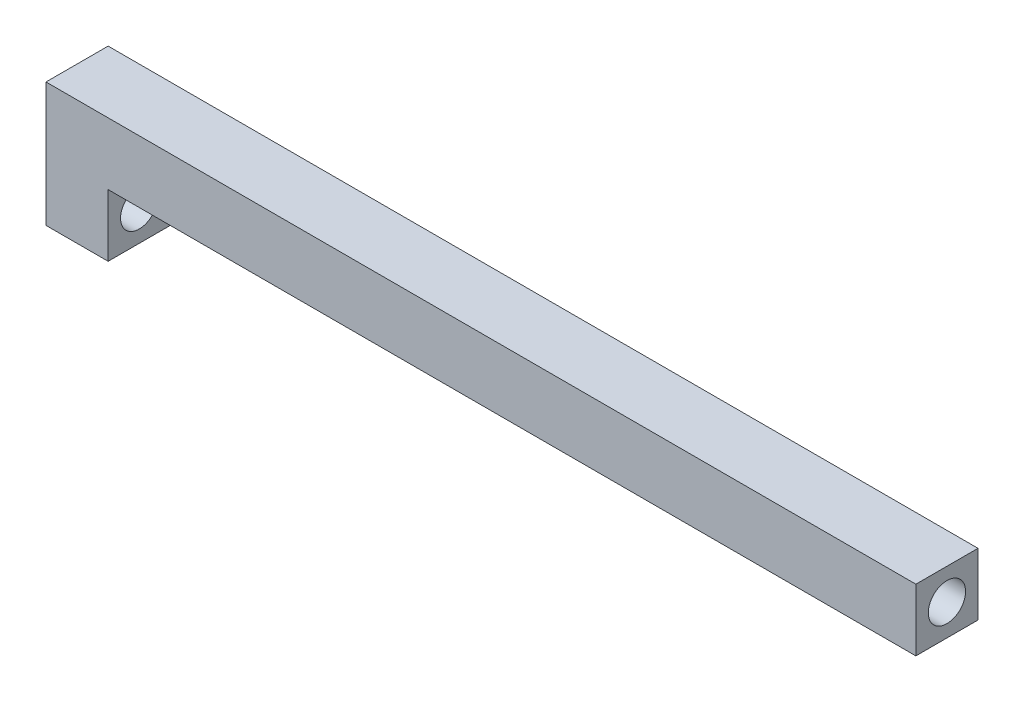
ISO-10303-21;
HEADER;
FILE_DESCRIPTION(('STEP AP214'),'2;1');
FILE_NAME('part.step','',(''),(''),'','','');
FILE_SCHEMA(('AUTOMOTIVE_DESIGN { 1 0 10303 214 1 1 1 1 }'));
ENDSEC;
DATA;
#1=APPLICATION_CONTEXT('core data for automotive mechanical design processes');
#2=APPLICATION_PROTOCOL_DEFINITION('international standard','automotive_design',2000,#1);
#3=PRODUCT_CONTEXT('',#1,'mechanical');
#4=PRODUCT('Part','Part','',(#3));
#5=PRODUCT_RELATED_PRODUCT_CATEGORY('part','',(#4));
#6=PRODUCT_DEFINITION_FORMATION('','',#4);
#7=PRODUCT_DEFINITION_CONTEXT('part definition',#1,'design');
#8=PRODUCT_DEFINITION('design','',#6,#7);
#9=PRODUCT_DEFINITION_SHAPE('','',#8);
#10=(LENGTH_UNIT() NAMED_UNIT(*) SI_UNIT(.MILLI.,.METRE.));
#11=(NAMED_UNIT(*) PLANE_ANGLE_UNIT() SI_UNIT($,.RADIAN.));
#12=(NAMED_UNIT(*) SI_UNIT($,.STERADIAN.) SOLID_ANGLE_UNIT());
#13=UNCERTAINTY_MEASURE_WITH_UNIT(LENGTH_MEASURE(1.E-05),#10,'distance_accuracy_value','');
#14=(GEOMETRIC_REPRESENTATION_CONTEXT(3) GLOBAL_UNCERTAINTY_ASSIGNED_CONTEXT((#13)) GLOBAL_UNIT_ASSIGNED_CONTEXT((#10,
#11,#12)) REPRESENTATION_CONTEXT('',''));
#15=CARTESIAN_POINT('',(0.,0.,0.));
#16=DIRECTION('',(0.,0.,1.));
#17=DIRECTION('',(1.,0.,0.));
#18=AXIS2_PLACEMENT_3D('',#15,#16,#17);
#19=CARTESIAN_POINT('',(-140.,10.,10.));
#20=DIRECTION('',(1.,0.,0.));
#21=DIRECTION('',(0.,1.,0.));
#22=AXIS2_PLACEMENT_3D('',#19,#20,#21);
#23=PLANE('',#22);
#24=CARTESIAN_POINT('',(-140.,-5.,5.));
#25=DIRECTION('',(1.,0.,0.));
#26=DIRECTION('',(0.,1.,0.));
#27=AXIS2_PLACEMENT_3D('',#24,#25,#26);
#28=CIRCLE('',#27,3.);
#29=CARTESIAN_POINT('',(-140.,-2.,5.));
#30=VERTEX_POINT('',#29);
#31=EDGE_CURVE('E134',#30,#30,#28,.T.);
#32=ORIENTED_EDGE('',*,*,#31,.T.);
#33=EDGE_LOOP('',(#32));
#34=FACE_BOUND('',#33,.T.);
#35=DIRECTION('',(0.,-1.,0.));
#36=VECTOR('',#35,1.);
#37=CARTESIAN_POINT('',(-140.,10.,0.));
#38=LINE('',#37,#36);
#39=CARTESIAN_POINT('',(-140.,10.,0.));
#40=VERTEX_POINT('',#39);
#41=CARTESIAN_POINT('',(-140.,-10.,0.));
#42=VERTEX_POINT('',#41);
#43=EDGE_CURVE('E129',#40,#42,#38,.T.);
#44=ORIENTED_EDGE('',*,*,#43,.T.);
#45=DIRECTION('',(0.,0.,-1.));
#46=VECTOR('',#45,1.);
#47=CARTESIAN_POINT('',(-140.,-10.,10.));
#48=LINE('',#47,#46);
#49=CARTESIAN_POINT('',(-140.,-10.,10.));
#50=VERTEX_POINT('',#49);
#51=EDGE_CURVE('E11',#50,#42,#48,.T.);
#52=ORIENTED_EDGE('',*,*,#51,.F.);
#53=DIRECTION('',(0.,-1.,0.));
#54=VECTOR('',#53,1.);
#55=CARTESIAN_POINT('',(-140.,10.,10.));
#56=LINE('',#55,#54);
#57=CARTESIAN_POINT('',(-140.,10.,10.));
#58=VERTEX_POINT('',#57);
#59=EDGE_CURVE('E146',#58,#50,#56,.T.);
#60=ORIENTED_EDGE('',*,*,#59,.F.);
#61=DIRECTION('',(0.,0.,-1.));
#62=VECTOR('',#61,1.);
#63=CARTESIAN_POINT('',(-140.,10.,10.));
#64=LINE('',#63,#62);
#65=EDGE_CURVE('E125',#58,#40,#64,.T.);
#66=ORIENTED_EDGE('',*,*,#65,.T.);
#67=EDGE_LOOP('',(#44,#52,#60,#66));
#68=FACE_BOUND('',#67,.T.);
#69=ADVANCED_FACE('F39',(#34,#68),#23,.F.);
#70=CARTESIAN_POINT('',(-140.,-10.,10.));
#71=DIRECTION('',(0.,1.,0.));
#72=DIRECTION('',(-1.,0.,0.));
#73=AXIS2_PLACEMENT_3D('',#70,#71,#72);
#74=PLANE('',#73);
#75=DIRECTION('',(1.,0.,0.));
#76=VECTOR('',#75,1.);
#77=CARTESIAN_POINT('',(-140.,-10.,0.));
#78=LINE('',#77,#76);
#79=CARTESIAN_POINT('',(-130.,-10.,0.));
#80=VERTEX_POINT('',#79);
#81=EDGE_CURVE('E133',#42,#80,#78,.T.);
#82=ORIENTED_EDGE('',*,*,#81,.T.);
#83=DIRECTION('',(0.,0.,-1.));
#84=VECTOR('',#83,1.);
#85=CARTESIAN_POINT('',(-130.,-10.,10.));
#86=LINE('',#85,#84);
#87=CARTESIAN_POINT('',(-130.,-10.,10.));
#88=VERTEX_POINT('',#87);
#89=EDGE_CURVE('E49',#88,#80,#86,.T.);
#90=ORIENTED_EDGE('',*,*,#89,.F.);
#91=DIRECTION('',(1.,0.,0.));
#92=VECTOR('',#91,1.);
#93=CARTESIAN_POINT('',(-140.,-10.,10.));
#94=LINE('',#93,#92);
#95=EDGE_CURVE('E94',#50,#88,#94,.T.);
#96=ORIENTED_EDGE('',*,*,#95,.F.);
#97=ORIENTED_EDGE('',*,*,#51,.T.);
#98=EDGE_LOOP('',(#82,#90,#96,#97));
#99=FACE_BOUND('',#98,.T.);
#100=ADVANCED_FACE('F176',(#99),#74,.F.);
#101=CARTESIAN_POINT('',(-130.,0.,10.));
#102=DIRECTION('',(-1.,0.,0.));
#103=DIRECTION('',(0.,0.,1.));
#104=AXIS2_PLACEMENT_3D('',#101,#102,#103);
#105=PLANE('',#104);
#106=CARTESIAN_POINT('',(-130.,-5.,5.));
#107=DIRECTION('',(-1.,0.,0.));
#108=DIRECTION('',(0.,0.,1.));
#109=AXIS2_PLACEMENT_3D('',#106,#107,#108);
#110=CIRCLE('',#109,3.);
#111=CARTESIAN_POINT('',(-130.,-5.,8.));
#112=VERTEX_POINT('',#111);
#113=EDGE_CURVE('E42',#112,#112,#110,.T.);
#114=ORIENTED_EDGE('',*,*,#113,.T.);
#115=EDGE_LOOP('',(#114));
#116=FACE_BOUND('',#115,.T.);
#117=DIRECTION('',(0.,1.,0.));
#118=VECTOR('',#117,1.);
#119=CARTESIAN_POINT('',(-130.,0.,0.));
#120=LINE('',#119,#118);
#121=CARTESIAN_POINT('',(-130.,0.,0.));
#122=VERTEX_POINT('',#121);
#123=EDGE_CURVE('E137',#80,#122,#120,.T.);
#124=ORIENTED_EDGE('',*,*,#123,.T.);
#125=DIRECTION('',(0.,0.,-1.));
#126=VECTOR('',#125,1.);
#127=CARTESIAN_POINT('',(-130.,0.,10.));
#128=LINE('',#127,#126);
#129=CARTESIAN_POINT('',(-130.,0.,10.));
#130=VERTEX_POINT('',#129);
#131=EDGE_CURVE('E118',#130,#122,#128,.T.);
#132=ORIENTED_EDGE('',*,*,#131,.F.);
#133=DIRECTION('',(0.,1.,0.));
#134=VECTOR('',#133,1.);
#135=CARTESIAN_POINT('',(-130.,0.,10.));
#136=LINE('',#135,#134);
#137=EDGE_CURVE('E107',#88,#130,#136,.T.);
#138=ORIENTED_EDGE('',*,*,#137,.F.);
#139=ORIENTED_EDGE('',*,*,#89,.T.);
#140=EDGE_LOOP('',(#124,#132,#138,#139));
#141=FACE_BOUND('',#140,.T.);
#142=ADVANCED_FACE('F157',(#116,#141),#105,.F.);
#143=CARTESIAN_POINT('',(-130.,0.,10.));
#144=DIRECTION('',(0.,1.,0.));
#145=DIRECTION('',(-1.,0.,0.));
#146=AXIS2_PLACEMENT_3D('',#143,#144,#145);
#147=PLANE('',#146);
#148=DIRECTION('',(1.,0.,0.));
#149=VECTOR('',#148,1.);
#150=CARTESIAN_POINT('',(-130.,0.,0.));
#151=LINE('',#150,#149);
#152=CARTESIAN_POINT('',(0.,3.6663897683068E-13,0.));
#153=VERTEX_POINT('',#152);
#154=EDGE_CURVE('E116',#122,#153,#151,.T.);
#155=ORIENTED_EDGE('',*,*,#154,.T.);
#156=DIRECTION('',(0.,0.,-1.));
#157=VECTOR('',#156,1.);
#158=CARTESIAN_POINT('',(0.,3.6663897683068E-13,10.));
#159=LINE('',#158,#157);
#160=CARTESIAN_POINT('',(0.,3.6663897683068E-13,10.));
#161=VERTEX_POINT('',#160);
#162=EDGE_CURVE('E113',#161,#153,#159,.T.);
#163=ORIENTED_EDGE('',*,*,#162,.F.);
#164=DIRECTION('',(1.,0.,0.));
#165=VECTOR('',#164,1.);
#166=CARTESIAN_POINT('',(-130.,0.,10.));
#167=LINE('',#166,#165);
#168=EDGE_CURVE('E101',#130,#161,#167,.T.);
#169=ORIENTED_EDGE('',*,*,#168,.F.);
#170=ORIENTED_EDGE('',*,*,#131,.T.);
#171=EDGE_LOOP('',(#155,#163,#169,#170));
#172=FACE_BOUND('',#171,.T.);
#173=ADVANCED_FACE('F114',(#172),#147,.F.);
#174=CARTESIAN_POINT('',(0.,10.,10.));
#175=DIRECTION('',(-1.,0.,0.));
#176=DIRECTION('',(0.,-1.,0.));
#177=AXIS2_PLACEMENT_3D('',#174,#175,#176);
#178=PLANE('',#177);
#179=CARTESIAN_POINT('',(0.,5.,5.));
#180=DIRECTION('',(1.,0.,0.));
#181=DIRECTION('',(0.,0.,-1.));
#182=AXIS2_PLACEMENT_3D('',#179,#180,#181);
#183=CIRCLE('',#182,3.);
#184=CARTESIAN_POINT('',(0.,5.,2.));
#185=VERTEX_POINT('',#184);
#186=EDGE_CURVE('E191',#185,#185,#183,.T.);
#187=ORIENTED_EDGE('',*,*,#186,.F.);
#188=EDGE_LOOP('',(#187));
#189=FACE_BOUND('',#188,.T.);
#190=DIRECTION('',(0.,1.,0.));
#191=VECTOR('',#190,1.);
#192=CARTESIAN_POINT('',(0.,10.,0.));
#193=LINE('',#192,#191);
#194=CARTESIAN_POINT('',(0.,10.,0.));
#195=VERTEX_POINT('',#194);
#196=EDGE_CURVE('E80',#153,#195,#193,.T.);
#197=ORIENTED_EDGE('',*,*,#196,.T.);
#198=DIRECTION('',(0.,0.,-1.));
#199=VECTOR('',#198,1.);
#200=CARTESIAN_POINT('',(0.,10.,10.));
#201=LINE('',#200,#199);
#202=CARTESIAN_POINT('',(0.,10.,10.));
#203=VERTEX_POINT('',#202);
#204=EDGE_CURVE('E119',#203,#195,#201,.T.);
#205=ORIENTED_EDGE('',*,*,#204,.F.);
#206=DIRECTION('',(0.,1.,0.));
#207=VECTOR('',#206,1.);
#208=CARTESIAN_POINT('',(0.,10.,10.));
#209=LINE('',#208,#207);
#210=EDGE_CURVE('E105',#161,#203,#209,.T.);
#211=ORIENTED_EDGE('',*,*,#210,.F.);
#212=ORIENTED_EDGE('',*,*,#162,.T.);
#213=EDGE_LOOP('',(#197,#205,#211,#212));
#214=FACE_BOUND('',#213,.T.);
#215=ADVANCED_FACE('F121',(#189,#214),#178,.F.);
#216=CARTESIAN_POINT('',(-140.,10.,10.));
#217=DIRECTION('',(0.,-1.,0.));
#218=DIRECTION('',(0.,0.,-1.));
#219=AXIS2_PLACEMENT_3D('',#216,#217,#218);
#220=PLANE('',#219);
#221=DIRECTION('',(-1.,0.,0.));
#222=VECTOR('',#221,1.);
#223=CARTESIAN_POINT('',(-140.,10.,0.));
#224=LINE('',#223,#222);
#225=EDGE_CURVE('E86',#195,#40,#224,.T.);
#226=ORIENTED_EDGE('',*,*,#225,.T.);
#227=ORIENTED_EDGE('',*,*,#65,.F.);
#228=DIRECTION('',(-1.,0.,0.));
#229=VECTOR('',#228,1.);
#230=CARTESIAN_POINT('',(-140.,10.,10.));
#231=LINE('',#230,#229);
#232=EDGE_CURVE('E57',#203,#58,#231,.T.);
#233=ORIENTED_EDGE('',*,*,#232,.F.);
#234=ORIENTED_EDGE('',*,*,#204,.T.);
#235=EDGE_LOOP('',(#226,#227,#233,#234));
#236=FACE_BOUND('',#235,.T.);
#237=ADVANCED_FACE('F164',(#236),#220,.F.);
#238=CARTESIAN_POINT('',(0.,0.,10.));
#239=DIRECTION('',(0.,0.,1.));
#240=DIRECTION('',(1.,0.,0.));
#241=AXIS2_PLACEMENT_3D('',#238,#239,#240);
#242=PLANE('',#241);
#243=ORIENTED_EDGE('',*,*,#59,.T.);
#244=ORIENTED_EDGE('',*,*,#95,.T.);
#245=ORIENTED_EDGE('',*,*,#137,.T.);
#246=ORIENTED_EDGE('',*,*,#168,.T.);
#247=ORIENTED_EDGE('',*,*,#210,.T.);
#248=ORIENTED_EDGE('',*,*,#232,.T.);
#249=EDGE_LOOP('',(#243,#244,#245,#246,#247,#248));
#250=FACE_BOUND('',#249,.T.);
#251=ADVANCED_FACE('F103',(#250),#242,.T.);
#252=CARTESIAN_POINT('',(0.,0.,0.));
#253=DIRECTION('',(0.,0.,1.));
#254=DIRECTION('',(1.,0.,0.));
#255=AXIS2_PLACEMENT_3D('',#252,#253,#254);
#256=PLANE('',#255);
#257=ORIENTED_EDGE('',*,*,#43,.F.);
#258=ORIENTED_EDGE('',*,*,#225,.F.);
#259=ORIENTED_EDGE('',*,*,#196,.F.);
#260=ORIENTED_EDGE('',*,*,#154,.F.);
#261=ORIENTED_EDGE('',*,*,#123,.F.);
#262=ORIENTED_EDGE('',*,*,#81,.F.);
#263=EDGE_LOOP('',(#257,#258,#259,#260,#261,#262));
#264=FACE_BOUND('',#263,.T.);
#265=ADVANCED_FACE('F160',(#264),#256,.F.);
#266=CARTESIAN_POINT('',(-150.,-5.,5.));
#267=DIRECTION('',(1.,0.,0.));
#268=DIRECTION('',(0.,0.,-1.));
#269=AXIS2_PLACEMENT_3D('',#266,#267,#268);
#270=CYLINDRICAL_SURFACE('',#269,3.);
#271=ORIENTED_EDGE('',*,*,#113,.F.);
#272=EDGE_LOOP('',(#271));
#273=FACE_BOUND('',#272,.T.);
#274=ORIENTED_EDGE('',*,*,#31,.F.);
#275=EDGE_LOOP('',(#274));
#276=FACE_BOUND('',#275,.T.);
#277=ADVANCED_FACE('F208',(#273,#276),#270,.F.);
#278=CARTESIAN_POINT('',(-20.,5.,5.));
#279=DIRECTION('',(1.,0.,0.));
#280=DIRECTION('',(0.,0.,-1.));
#281=AXIS2_PLACEMENT_3D('',#278,#279,#280);
#282=CYLINDRICAL_SURFACE('',#281,3.);
#283=CARTESIAN_POINT('',(-20.,5.,5.));
#284=DIRECTION('',(1.,0.,0.));
#285=DIRECTION('',(0.,0.,-1.));
#286=AXIS2_PLACEMENT_3D('',#283,#284,#285);
#287=CIRCLE('',#286,3.);
#288=CARTESIAN_POINT('',(-20.,5.,2.));
#289=VERTEX_POINT('',#288);
#290=EDGE_CURVE('E188',#289,#289,#287,.T.);
#291=ORIENTED_EDGE('',*,*,#290,.F.);
#292=EDGE_LOOP('',(#291));
#293=FACE_BOUND('',#292,.T.);
#294=ORIENTED_EDGE('',*,*,#186,.T.);
#295=EDGE_LOOP('',(#294));
#296=FACE_BOUND('',#295,.T.);
#297=ADVANCED_FACE('F205',(#293,#296),#282,.F.);
#298=CARTESIAN_POINT('',(-20.,5.,5.));
#299=DIRECTION('',(1.,0.,0.));
#300=DIRECTION('',(0.,0.,-1.));
#301=AXIS2_PLACEMENT_3D('',#298,#299,#300);
#302=PLANE('',#301);
#303=ORIENTED_EDGE('',*,*,#290,.T.);
#304=EDGE_LOOP('',(#303));
#305=FACE_BOUND('',#304,.T.);
#306=ADVANCED_FACE('F203',(#305),#302,.T.);
#307=CLOSED_SHELL('',(#69,#100,#142,#173,#215,#237,#251,#265,#277,#297,#306));
#308=MANIFOLD_SOLID_BREP('B2',#307);
#309=ADVANCED_BREP_SHAPE_REPRESENTATION('',(#18,#308),#14);
#310=SHAPE_DEFINITION_REPRESENTATION(#9,#309);
ENDSEC;
END-ISO-10303-21;
